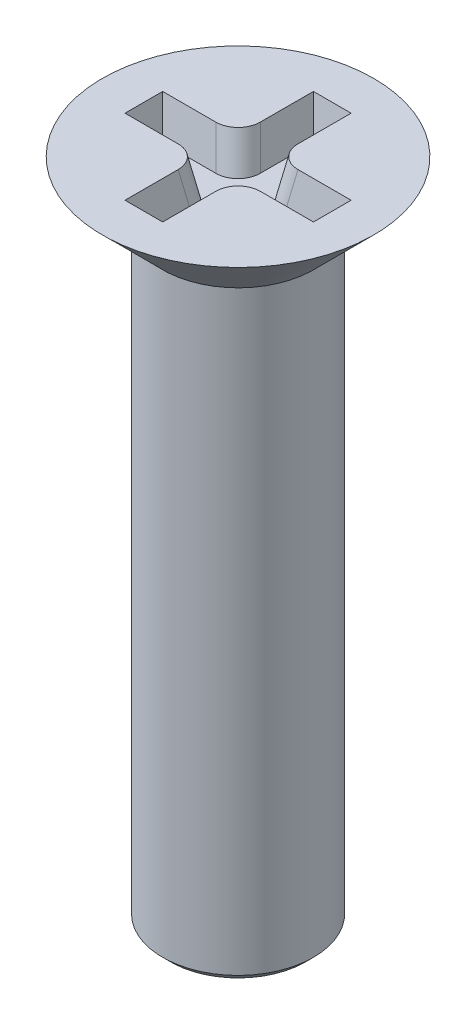
ISO-10303-21;
HEADER;
FILE_DESCRIPTION(('STEP AP214'),'2;1');
FILE_NAME('part.step','',(''),(''),'','','');
FILE_SCHEMA(('AUTOMOTIVE_DESIGN { 1 0 10303 214 1 1 1 1 }'));
ENDSEC;
DATA;
#1=APPLICATION_CONTEXT('core data for automotive mechanical design processes');
#2=APPLICATION_PROTOCOL_DEFINITION('international standard','automotive_design',2000,#1);
#3=PRODUCT_CONTEXT('',#1,'mechanical');
#4=PRODUCT('Part','Part','',(#3));
#5=PRODUCT_RELATED_PRODUCT_CATEGORY('part','',(#4));
#6=PRODUCT_DEFINITION_FORMATION('','',#4);
#7=PRODUCT_DEFINITION_CONTEXT('part definition',#1,'design');
#8=PRODUCT_DEFINITION('design','',#6,#7);
#9=PRODUCT_DEFINITION_SHAPE('','',#8);
#10=(LENGTH_UNIT() NAMED_UNIT(*) SI_UNIT(.MILLI.,.METRE.));
#11=(NAMED_UNIT(*) PLANE_ANGLE_UNIT() SI_UNIT($,.RADIAN.));
#12=(NAMED_UNIT(*) SI_UNIT($,.STERADIAN.) SOLID_ANGLE_UNIT());
#13=UNCERTAINTY_MEASURE_WITH_UNIT(LENGTH_MEASURE(1.E-05),#10,'distance_accuracy_value','');
#14=(GEOMETRIC_REPRESENTATION_CONTEXT(3) GLOBAL_UNCERTAINTY_ASSIGNED_CONTEXT((#13)) GLOBAL_UNIT_ASSIGNED_CONTEXT((#10,
#11,#12)) REPRESENTATION_CONTEXT('',''));
#15=CARTESIAN_POINT('',(0.,0.,0.));
#16=DIRECTION('',(0.,0.,1.));
#17=DIRECTION('',(1.,0.,0.));
#18=AXIS2_PLACEMENT_3D('',#15,#16,#17);
#19=CARTESIAN_POINT('',(0.,0.,0.));
#20=DIRECTION('',(0.,1.,0.));
#21=DIRECTION('',(0.,0.,1.));
#22=AXIS2_PLACEMENT_3D('',#19,#20,#21);
#23=PLANE('',#22);
#24=CARTESIAN_POINT('',(0.,0.,0.));
#25=DIRECTION('',(0.,-1.,0.));
#26=DIRECTION('',(0.,0.,-1.));
#27=AXIS2_PLACEMENT_3D('',#24,#25,#26);
#28=CIRCLE('',#27,1.8);
#29=CARTESIAN_POINT('',(0.,0.,-1.8));
#30=VERTEX_POINT('',#29);
#31=EDGE_CURVE('E256',#30,#30,#28,.T.);
#32=ORIENTED_EDGE('',*,*,#31,.F.);
#33=EDGE_LOOP('',(#32));
#34=FACE_BOUND('',#33,.T.);
#35=DIRECTION('',(1.,0.,0.));
#36=VECTOR('',#35,1.);
#37=CARTESIAN_POINT('',(0.,0.,-0.25));
#38=LINE('',#37,#36);
#39=CARTESIAN_POINT('',(-1.25,0.,-0.25));
#40=VERTEX_POINT('',#39);
#41=CARTESIAN_POINT('',(-0.545442325903662,0.,-0.25));
#42=VERTEX_POINT('',#41);
#43=EDGE_CURVE('E186',#40,#42,#38,.T.);
#44=ORIENTED_EDGE('',*,*,#43,.T.);
#45=CARTESIAN_POINT('',(-0.554627983565723,0.,-0.554627983565723));
#46=DIRECTION('',(0.,1.,0.));
#47=DIRECTION('',(-0.707106781186548,0.,-0.707106781186547));
#48=AXIS2_PLACEMENT_3D('',#45,#46,#47);
#49=ELLIPSE('',#48,0.309186702079241,0.3);
#50=CARTESIAN_POINT('',(-0.25,0.,-0.545442325903662));
#51=VERTEX_POINT('',#50);
#52=EDGE_CURVE('E274',#42,#51,#49,.T.);
#53=ORIENTED_EDGE('',*,*,#52,.T.);
#54=DIRECTION('',(0.,0.,1.));
#55=VECTOR('',#54,1.);
#56=CARTESIAN_POINT('',(-0.25,0.,0.));
#57=LINE('',#56,#55);
#58=CARTESIAN_POINT('',(-0.25,0.,-1.25));
#59=VERTEX_POINT('',#58);
#60=EDGE_CURVE('E184',#59,#51,#57,.T.);
#61=ORIENTED_EDGE('',*,*,#60,.F.);
#62=DIRECTION('',(1.,0.,0.));
#63=VECTOR('',#62,1.);
#64=CARTESIAN_POINT('',(0.,0.,-1.25));
#65=LINE('',#64,#63);
#66=CARTESIAN_POINT('',(0.25,0.,-1.25));
#67=VERTEX_POINT('',#66);
#68=EDGE_CURVE('E163',#59,#67,#65,.T.);
#69=ORIENTED_EDGE('',*,*,#68,.T.);
#70=DIRECTION('',(0.,0.,1.));
#71=VECTOR('',#70,1.);
#72=CARTESIAN_POINT('',(0.25,0.,0.));
#73=LINE('',#72,#71);
#74=CARTESIAN_POINT('',(0.25,0.,-0.545442325903662));
#75=VERTEX_POINT('',#74);
#76=EDGE_CURVE('E175',#67,#75,#73,.T.);
#77=ORIENTED_EDGE('',*,*,#76,.T.);
#78=CARTESIAN_POINT('',(0.554627983565724,0.,-0.554627983565723));
#79=DIRECTION('',(0.,1.,0.));
#80=DIRECTION('',(0.707106781186547,0.,-0.707106781186548));
#81=AXIS2_PLACEMENT_3D('',#78,#79,#80);
#82=ELLIPSE('',#81,0.309186702079241,0.3);
#83=CARTESIAN_POINT('',(0.545442325903663,0.,-0.25));
#84=VERTEX_POINT('',#83);
#85=EDGE_CURVE('E272',#75,#84,#82,.T.);
#86=ORIENTED_EDGE('',*,*,#85,.T.);
#87=DIRECTION('',(1.,0.,0.));
#88=VECTOR('',#87,1.);
#89=CARTESIAN_POINT('',(0.,0.,-0.25));
#90=LINE('',#89,#88);
#91=CARTESIAN_POINT('',(1.25,0.,-0.25));
#92=VERTEX_POINT('',#91);
#93=EDGE_CURVE('E180',#84,#92,#90,.T.);
#94=ORIENTED_EDGE('',*,*,#93,.T.);
#95=DIRECTION('',(0.,0.,-1.));
#96=VECTOR('',#95,1.);
#97=CARTESIAN_POINT('',(1.25,0.,0.));
#98=LINE('',#97,#96);
#99=CARTESIAN_POINT('',(1.25,0.,0.25));
#100=VERTEX_POINT('',#99);
#101=EDGE_CURVE('E206',#100,#92,#98,.T.);
#102=ORIENTED_EDGE('',*,*,#101,.F.);
#103=DIRECTION('',(1.,0.,0.));
#104=VECTOR('',#103,1.);
#105=CARTESIAN_POINT('',(0.,0.,0.25));
#106=LINE('',#105,#104);
#107=CARTESIAN_POINT('',(0.545442325903663,0.,0.25));
#108=VERTEX_POINT('',#107);
#109=EDGE_CURVE('E204',#108,#100,#106,.T.);
#110=ORIENTED_EDGE('',*,*,#109,.F.);
#111=CARTESIAN_POINT('',(0.554627983565724,0.,0.554627983565724));
#112=DIRECTION('',(0.,1.,0.));
#113=DIRECTION('',(0.707106781186548,0.,0.707106781186547));
#114=AXIS2_PLACEMENT_3D('',#111,#112,#113);
#115=ELLIPSE('',#114,0.309186702079241,0.3);
#116=CARTESIAN_POINT('',(0.25,0.,0.545442325903663));
#117=VERTEX_POINT('',#116);
#118=EDGE_CURVE('E268',#108,#117,#115,.T.);
#119=ORIENTED_EDGE('',*,*,#118,.T.);
#120=DIRECTION('',(0.,0.,1.));
#121=VECTOR('',#120,1.);
#122=CARTESIAN_POINT('',(0.25,0.,0.));
#123=LINE('',#122,#121);
#124=CARTESIAN_POINT('',(0.250000000000001,0.,1.25));
#125=VERTEX_POINT('',#124);
#126=EDGE_CURVE('E202',#117,#125,#123,.T.);
#127=ORIENTED_EDGE('',*,*,#126,.T.);
#128=DIRECTION('',(1.,0.,0.));
#129=VECTOR('',#128,1.);
#130=CARTESIAN_POINT('',(0.,0.,1.25));
#131=LINE('',#130,#129);
#132=CARTESIAN_POINT('',(-0.249999999999999,0.,1.25));
#133=VERTEX_POINT('',#132);
#134=EDGE_CURVE('E199',#133,#125,#131,.T.);
#135=ORIENTED_EDGE('',*,*,#134,.F.);
#136=DIRECTION('',(0.,0.,1.));
#137=VECTOR('',#136,1.);
#138=CARTESIAN_POINT('',(-0.25,0.,0.));
#139=LINE('',#138,#137);
#140=CARTESIAN_POINT('',(-0.25,0.,0.545442325903662));
#141=VERTEX_POINT('',#140);
#142=EDGE_CURVE('E197',#141,#133,#139,.T.);
#143=ORIENTED_EDGE('',*,*,#142,.F.);
#144=CARTESIAN_POINT('',(-0.554627983565723,0.,0.554627983565724));
#145=DIRECTION('',(0.,1.,0.));
#146=DIRECTION('',(-0.707106781186547,0.,0.707106781186548));
#147=AXIS2_PLACEMENT_3D('',#144,#145,#146);
#148=ELLIPSE('',#147,0.309186702079241,0.3);
#149=CARTESIAN_POINT('',(-0.545442325903662,0.,0.25));
#150=VERTEX_POINT('',#149);
#151=EDGE_CURVE('E270',#141,#150,#148,.T.);
#152=ORIENTED_EDGE('',*,*,#151,.T.);
#153=DIRECTION('',(1.,0.,0.));
#154=VECTOR('',#153,1.);
#155=CARTESIAN_POINT('',(0.,0.,0.25));
#156=LINE('',#155,#154);
#157=CARTESIAN_POINT('',(-1.25,0.,0.25));
#158=VERTEX_POINT('',#157);
#159=EDGE_CURVE('E194',#158,#150,#156,.T.);
#160=ORIENTED_EDGE('',*,*,#159,.F.);
#161=DIRECTION('',(0.,0.,-1.));
#162=VECTOR('',#161,1.);
#163=CARTESIAN_POINT('',(-1.25,0.,0.));
#164=LINE('',#163,#162);
#165=EDGE_CURVE('E191',#158,#40,#164,.T.);
#166=ORIENTED_EDGE('',*,*,#165,.T.);
#167=EDGE_LOOP('',(#44,#53,#61,#69,#77,#86,#94,#102,#110,#119,#127,#135,#143,#152,#160,#166));
#168=FACE_BOUND('',#167,.T.);
#169=ADVANCED_FACE('F47',(#34,#168),#23,.T.);
#170=CARTESIAN_POINT('',(0.,-0.8,0.));
#171=DIRECTION('',(0.,1.,0.));
#172=DIRECTION('',(0.,0.,1.));
#173=AXIS2_PLACEMENT_3D('',#170,#171,#172);
#174=CONICAL_SURFACE('',#173,1.,0.785398163397448);
#175=ORIENTED_EDGE('',*,*,#31,.T.);
#176=EDGE_LOOP('',(#175));
#177=FACE_BOUND('',#176,.T.);
#178=CARTESIAN_POINT('',(0.,-0.8,0.));
#179=DIRECTION('',(0.,-1.,0.));
#180=DIRECTION('',(0.,0.,-1.));
#181=AXIS2_PLACEMENT_3D('',#178,#179,#180);
#182=CIRCLE('',#181,1.);
#183=CARTESIAN_POINT('',(0.,-0.8,-1.));
#184=VERTEX_POINT('',#183);
#185=EDGE_CURVE('E212',#184,#184,#182,.T.);
#186=ORIENTED_EDGE('',*,*,#185,.F.);
#187=EDGE_LOOP('',(#186));
#188=FACE_BOUND('',#187,.T.);
#189=ADVANCED_FACE('F351',(#177,#188),#174,.T.);
#190=CARTESIAN_POINT('',(0.,-8.8,0.));
#191=DIRECTION('',(0.,1.,0.));
#192=DIRECTION('',(0.,0.,1.));
#193=AXIS2_PLACEMENT_3D('',#190,#191,#192);
#194=CYLINDRICAL_SURFACE('',#193,1.);
#195=CARTESIAN_POINT('',(0.,-8.7,0.));
#196=DIRECTION('',(0.,-1.,0.));
#197=DIRECTION('',(0.,0.,-1.));
#198=AXIS2_PLACEMENT_3D('',#195,#196,#197);
#199=CIRCLE('',#198,1.);
#200=CARTESIAN_POINT('',(0.,-8.7,-1.));
#201=VERTEX_POINT('',#200);
#202=EDGE_CURVE('E262',#201,#201,#199,.F.);
#203=ORIENTED_EDGE('',*,*,#202,.T.);
#204=EDGE_LOOP('',(#203));
#205=FACE_BOUND('',#204,.T.);
#206=ORIENTED_EDGE('',*,*,#185,.T.);
#207=EDGE_LOOP('',(#206));
#208=FACE_BOUND('',#207,.T.);
#209=ADVANCED_FACE('F359',(#205,#208),#194,.T.);
#210=CARTESIAN_POINT('',(0.,-8.8,0.));
#211=DIRECTION('',(0.,-1.,0.));
#212=DIRECTION('',(0.,0.,-1.));
#213=AXIS2_PLACEMENT_3D('',#210,#211,#212);
#214=PLANE('',#213);
#215=CARTESIAN_POINT('',(0.,-8.8,0.));
#216=DIRECTION('',(0.,-1.,0.));
#217=DIRECTION('',(0.,0.,-1.));
#218=AXIS2_PLACEMENT_3D('',#215,#216,#217);
#219=CIRCLE('',#218,0.900000000000001);
#220=CARTESIAN_POINT('',(0.,-8.8,-0.900000000000001));
#221=VERTEX_POINT('',#220);
#222=EDGE_CURVE('E259',#221,#221,#219,.T.);
#223=ORIENTED_EDGE('',*,*,#222,.T.);
#224=EDGE_LOOP('',(#223));
#225=FACE_BOUND('',#224,.T.);
#226=ADVANCED_FACE('F371',(#225),#214,.T.);
#227=CARTESIAN_POINT('',(0.,-8.8,0.));
#228=DIRECTION('',(0.,1.,0.));
#229=DIRECTION('',(0.,0.,1.));
#230=AXIS2_PLACEMENT_3D('',#227,#228,#229);
#231=CONICAL_SURFACE('',#230,0.900000000000001,0.78539816339744);
#232=ORIENTED_EDGE('',*,*,#202,.F.);
#233=EDGE_LOOP('',(#232));
#234=FACE_BOUND('',#233,.T.);
#235=ORIENTED_EDGE('',*,*,#222,.F.);
#236=EDGE_LOOP('',(#235));
#237=FACE_BOUND('',#236,.T.);
#238=ADVANCED_FACE('F366',(#234,#237),#231,.T.);
#239=CARTESIAN_POINT('',(0.,0.,-0.25));
#240=DIRECTION('',(0.,-0.17364817766693,-0.984807753012208));
#241=DIRECTION('',(0.,0.984807753012208,-0.17364817766693));
#242=AXIS2_PLACEMENT_3D('',#239,#240,#241);
#243=PLANE('',#242);
#244=ORIENTED_EDGE('',*,*,#93,.F.);
#245=DIRECTION('',(-0.171087869746036,-0.970287525247814,0.171087869746036));
#246=VECTOR('',#245,1.);
#247=CARTESIAN_POINT('',(0.529476651306003,-0.0905458400836372,-0.234034325402341));
#248=LINE('',#247,#246);
#249=CARTESIAN_POINT('',(0.45727883554943,-0.5,-0.161836509645767));
#250=VERTEX_POINT('',#249);
#251=EDGE_CURVE('E279',#84,#250,#248,.T.);
#252=ORIENTED_EDGE('',*,*,#251,.T.);
#253=DIRECTION('',(-1.,0.,0.));
#254=VECTOR('',#253,1.);
#255=CARTESIAN_POINT('',(0.,-0.5,-0.161836509645767));
#256=LINE('',#255,#254);
#257=CARTESIAN_POINT('',(1.16183650964577,-0.5,-0.161836509645767));
#258=VERTEX_POINT('',#257);
#259=EDGE_CURVE('E209',#250,#258,#256,.F.);
#260=ORIENTED_EDGE('',*,*,#259,.T.);
#261=DIRECTION('',(-0.171087869746036,-0.970287525247814,0.171087869746036));
#262=VECTOR('',#261,1.);
#263=CARTESIAN_POINT('',(1.2134111760322,-0.207505532169751,-0.213411176032204));
#264=LINE('',#263,#262);
#265=EDGE_CURVE('E210',#258,#92,#264,.F.);
#266=ORIENTED_EDGE('',*,*,#265,.T.);
#267=EDGE_LOOP('',(#244,#252,#260,#266));
#268=FACE_BOUND('',#267,.T.);
#269=ADVANCED_FACE('F335',(#268),#243,.F.);
#270=CARTESIAN_POINT('',(1.25,0.,0.));
#271=DIRECTION('',(0.984807753012208,-0.17364817766693,0.));
#272=DIRECTION('',(0.17364817766693,0.984807753012208,0.));
#273=AXIS2_PLACEMENT_3D('',#270,#271,#272);
#274=PLANE('',#273);
#275=ORIENTED_EDGE('',*,*,#101,.T.);
#276=ORIENTED_EDGE('',*,*,#265,.F.);
#277=DIRECTION('',(0.,0.,-1.));
#278=VECTOR('',#277,1.);
#279=CARTESIAN_POINT('',(1.16183650964577,-0.5,0.));
#280=LINE('',#279,#278);
#281=CARTESIAN_POINT('',(1.16183650964577,-0.5,0.161836509645768));
#282=VERTEX_POINT('',#281);
#283=EDGE_CURVE('E171',#282,#258,#280,.T.);
#284=ORIENTED_EDGE('',*,*,#283,.F.);
#285=DIRECTION('',(0.171087869746036,0.970287525247814,0.171087869746036));
#286=VECTOR('',#285,1.);
#287=CARTESIAN_POINT('',(1.2134111760322,-0.207505532169751,0.213411176032205));
#288=LINE('',#287,#286);
#289=EDGE_CURVE('E213',#282,#100,#288,.T.);
#290=ORIENTED_EDGE('',*,*,#289,.T.);
#291=EDGE_LOOP('',(#275,#276,#284,#290));
#292=FACE_BOUND('',#291,.T.);
#293=ADVANCED_FACE('F339',(#292),#274,.F.);
#294=CARTESIAN_POINT('',(0.,0.,0.25));
#295=DIRECTION('',(0.,-0.17364817766693,0.984807753012208));
#296=DIRECTION('',(0.,-0.984807753012208,-0.17364817766693));
#297=AXIS2_PLACEMENT_3D('',#294,#295,#296);
#298=PLANE('',#297);
#299=DIRECTION('',(1.,0.,0.));
#300=VECTOR('',#299,1.);
#301=CARTESIAN_POINT('',(0.,-0.5,0.161836509645768));
#302=LINE('',#301,#300);
#303=CARTESIAN_POINT('',(0.45727883554943,-0.5,0.161836509645768));
#304=VERTEX_POINT('',#303);
#305=EDGE_CURVE('E232',#304,#282,#302,.T.);
#306=ORIENTED_EDGE('',*,*,#305,.F.);
#307=DIRECTION('',(-0.171087869746036,-0.970287525247814,-0.171087869746036));
#308=VECTOR('',#307,1.);
#309=CARTESIAN_POINT('',(0.536794416099563,-0.049044733649687,0.2413520901959));
#310=LINE('',#309,#308);
#311=EDGE_CURVE('E286',#304,#108,#310,.F.);
#312=ORIENTED_EDGE('',*,*,#311,.T.);
#313=ORIENTED_EDGE('',*,*,#109,.T.);
#314=ORIENTED_EDGE('',*,*,#289,.F.);
#315=EDGE_LOOP('',(#306,#312,#313,#314));
#316=FACE_BOUND('',#315,.T.);
#317=ADVANCED_FACE('F343',(#316),#298,.F.);
#318=CARTESIAN_POINT('',(0.25,0.,0.));
#319=DIRECTION('',(0.984807753012208,-0.17364817766693,0.));
#320=DIRECTION('',(0.17364817766693,0.984807753012208,0.));
#321=AXIS2_PLACEMENT_3D('',#318,#319,#320);
#322=PLANE('',#321);
#323=ORIENTED_EDGE('',*,*,#126,.F.);
#324=DIRECTION('',(0.171087869746036,0.970287525247814,0.171087869746036));
#325=VECTOR('',#324,1.);
#326=CARTESIAN_POINT('',(0.153188599841668,-0.549044733649687,0.44863092574533));
#327=LINE('',#326,#325);
#328=CARTESIAN_POINT('',(0.161836509645768,-0.5,0.45727883554943));
#329=VERTEX_POINT('',#328);
#330=EDGE_CURVE('E62',#117,#329,#327,.F.);
#331=ORIENTED_EDGE('',*,*,#330,.T.);
#332=DIRECTION('',(0.,0.,-1.));
#333=VECTOR('',#332,1.);
#334=CARTESIAN_POINT('',(0.161836509645768,-0.5,0.));
#335=LINE('',#334,#333);
#336=CARTESIAN_POINT('',(0.161836509645768,-0.5,1.16183650964577));
#337=VERTEX_POINT('',#336);
#338=EDGE_CURVE('E234',#329,#337,#335,.F.);
#339=ORIENTED_EDGE('',*,*,#338,.T.);
#340=DIRECTION('',(-0.171087869746036,-0.970287525247814,-0.171087869746036));
#341=VECTOR('',#340,1.);
#342=CARTESIAN_POINT('',(0.213411176032205,-0.207505532169751,1.2134111760322));
#343=LINE('',#342,#341);
#344=EDGE_CURVE('E223',#337,#125,#343,.F.);
#345=ORIENTED_EDGE('',*,*,#344,.T.);
#346=EDGE_LOOP('',(#323,#331,#339,#345));
#347=FACE_BOUND('',#346,.T.);
#348=ADVANCED_FACE('F461',(#347),#322,.F.);
#349=CARTESIAN_POINT('',(0.,0.,1.25));
#350=DIRECTION('',(0.,-0.17364817766693,0.984807753012208));
#351=DIRECTION('',(0.,-0.984807753012208,-0.17364817766693));
#352=AXIS2_PLACEMENT_3D('',#349,#350,#351);
#353=PLANE('',#352);
#354=ORIENTED_EDGE('',*,*,#134,.T.);
#355=ORIENTED_EDGE('',*,*,#344,.F.);
#356=DIRECTION('',(1.,0.,0.));
#357=VECTOR('',#356,1.);
#358=CARTESIAN_POINT('',(0.,-0.5,1.16183650964577));
#359=LINE('',#358,#357);
#360=CARTESIAN_POINT('',(-0.161836509645767,-0.5,1.16183650964577));
#361=VERTEX_POINT('',#360);
#362=EDGE_CURVE('E236',#361,#337,#359,.T.);
#363=ORIENTED_EDGE('',*,*,#362,.F.);
#364=DIRECTION('',(-0.171087869746036,0.970287525247814,0.171087869746036));
#365=VECTOR('',#364,1.);
#366=CARTESIAN_POINT('',(-0.213411176032204,-0.207505532169751,1.2134111760322));
#367=LINE('',#366,#365);
#368=EDGE_CURVE('E220',#361,#133,#367,.T.);
#369=ORIENTED_EDGE('',*,*,#368,.T.);
#370=EDGE_LOOP('',(#354,#355,#363,#369));
#371=FACE_BOUND('',#370,.T.);
#372=ADVANCED_FACE('F453',(#371),#353,.F.);
#373=CARTESIAN_POINT('',(-0.25,0.,0.));
#374=DIRECTION('',(-0.984807753012208,-0.17364817766693,0.));
#375=DIRECTION('',(0.17364817766693,-0.984807753012208,0.));
#376=AXIS2_PLACEMENT_3D('',#373,#374,#375);
#377=PLANE('',#376);
#378=DIRECTION('',(0.,0.,1.));
#379=VECTOR('',#378,1.);
#380=CARTESIAN_POINT('',(-0.161836509645767,-0.5,0.));
#381=LINE('',#380,#379);
#382=CARTESIAN_POINT('',(-0.161836509645767,-0.5,0.45727883554943));
#383=VERTEX_POINT('',#382);
#384=EDGE_CURVE('E239',#383,#361,#381,.T.);
#385=ORIENTED_EDGE('',*,*,#384,.F.);
#386=DIRECTION('',(-0.171087869746036,0.970287525247814,0.171087869746036));
#387=VECTOR('',#386,1.);
#388=CARTESIAN_POINT('',(-0.23403432540234,-0.0905458400836372,0.529476651306003));
#389=LINE('',#388,#387);
#390=EDGE_CURVE('E281',#383,#141,#389,.T.);
#391=ORIENTED_EDGE('',*,*,#390,.T.);
#392=ORIENTED_EDGE('',*,*,#142,.T.);
#393=ORIENTED_EDGE('',*,*,#368,.F.);
#394=EDGE_LOOP('',(#385,#391,#392,#393));
#395=FACE_BOUND('',#394,.T.);
#396=ADVANCED_FACE('F304',(#395),#377,.F.);
#397=CARTESIAN_POINT('',(0.,0.,0.25));
#398=DIRECTION('',(0.,-0.17364817766693,0.984807753012208));
#399=DIRECTION('',(0.,-0.984807753012208,-0.17364817766693));
#400=AXIS2_PLACEMENT_3D('',#397,#398,#399);
#401=PLANE('',#400);
#402=ORIENTED_EDGE('',*,*,#159,.T.);
#403=DIRECTION('',(-0.171087869746036,0.970287525247814,0.171087869746036));
#404=VECTOR('',#403,1.);
#405=CARTESIAN_POINT('',(-0.529476651306003,-0.0905458400836371,0.234034325402341));
#406=LINE('',#405,#404);
#407=CARTESIAN_POINT('',(-0.457278835549429,-0.5,0.161836509645768));
#408=VERTEX_POINT('',#407);
#409=EDGE_CURVE('E284',#150,#408,#406,.F.);
#410=ORIENTED_EDGE('',*,*,#409,.T.);
#411=DIRECTION('',(1.,0.,0.));
#412=VECTOR('',#411,1.);
#413=CARTESIAN_POINT('',(0.,-0.5,0.161836509645768));
#414=LINE('',#413,#412);
#415=CARTESIAN_POINT('',(-1.16183650964577,-0.5,0.161836509645768));
#416=VERTEX_POINT('',#415);
#417=EDGE_CURVE('E241',#416,#408,#414,.T.);
#418=ORIENTED_EDGE('',*,*,#417,.F.);
#419=DIRECTION('',(0.171087869746036,-0.970287525247814,-0.171087869746036));
#420=VECTOR('',#419,1.);
#421=CARTESIAN_POINT('',(-1.2134111760322,-0.207505532169751,0.213411176032205));
#422=LINE('',#421,#420);
#423=EDGE_CURVE('E218',#416,#158,#422,.F.);
#424=ORIENTED_EDGE('',*,*,#423,.T.);
#425=EDGE_LOOP('',(#402,#410,#418,#424));
#426=FACE_BOUND('',#425,.T.);
#427=ADVANCED_FACE('F311',(#426),#401,.F.);
#428=CARTESIAN_POINT('',(-1.25,0.,0.));
#429=DIRECTION('',(-0.984807753012208,-0.17364817766693,0.));
#430=DIRECTION('',(0.17364817766693,-0.984807753012208,0.));
#431=AXIS2_PLACEMENT_3D('',#428,#429,#430);
#432=PLANE('',#431);
#433=ORIENTED_EDGE('',*,*,#165,.F.);
#434=ORIENTED_EDGE('',*,*,#423,.F.);
#435=DIRECTION('',(0.,0.,1.));
#436=VECTOR('',#435,1.);
#437=CARTESIAN_POINT('',(-1.16183650964577,-0.5,0.));
#438=LINE('',#437,#436);
#439=CARTESIAN_POINT('',(-1.16183650964577,-0.5,-0.161836509645767));
#440=VERTEX_POINT('',#439);
#441=EDGE_CURVE('E244',#416,#440,#438,.F.);
#442=ORIENTED_EDGE('',*,*,#441,.T.);
#443=DIRECTION('',(-0.171087869746036,0.970287525247814,-0.171087869746036));
#444=VECTOR('',#443,1.);
#445=CARTESIAN_POINT('',(-1.2134111760322,-0.207505532169751,-0.213411176032204));
#446=LINE('',#445,#444);
#447=EDGE_CURVE('E216',#440,#40,#446,.T.);
#448=ORIENTED_EDGE('',*,*,#447,.T.);
#449=EDGE_LOOP('',(#433,#434,#442,#448));
#450=FACE_BOUND('',#449,.T.);
#451=ADVANCED_FACE('F314',(#450),#432,.F.);
#452=CARTESIAN_POINT('',(0.,0.,-0.25));
#453=DIRECTION('',(0.,-0.17364817766693,-0.984807753012208));
#454=DIRECTION('',(0.,0.984807753012208,-0.17364817766693));
#455=AXIS2_PLACEMENT_3D('',#452,#453,#454);
#456=PLANE('',#455);
#457=DIRECTION('',(-1.,0.,0.));
#458=VECTOR('',#457,1.);
#459=CARTESIAN_POINT('',(0.,-0.5,-0.161836509645767));
#460=LINE('',#459,#458);
#461=CARTESIAN_POINT('',(-0.457278835549429,-0.5,-0.161836509645767));
#462=VERTEX_POINT('',#461);
#463=EDGE_CURVE('E246',#440,#462,#460,.F.);
#464=ORIENTED_EDGE('',*,*,#463,.T.);
#465=DIRECTION('',(-0.171087869746036,0.970287525247814,-0.171087869746036));
#466=VECTOR('',#465,1.);
#467=CARTESIAN_POINT('',(-0.536794416099562,-0.0490447336496869,-0.2413520901959));
#468=LINE('',#467,#466);
#469=EDGE_CURVE('E265',#462,#42,#468,.T.);
#470=ORIENTED_EDGE('',*,*,#469,.T.);
#471=ORIENTED_EDGE('',*,*,#43,.F.);
#472=ORIENTED_EDGE('',*,*,#447,.F.);
#473=EDGE_LOOP('',(#464,#470,#471,#472));
#474=FACE_BOUND('',#473,.T.);
#475=ADVANCED_FACE('F318',(#474),#456,.F.);
#476=CARTESIAN_POINT('',(-0.25,0.,0.));
#477=DIRECTION('',(-0.984807753012208,-0.17364817766693,0.));
#478=DIRECTION('',(0.17364817766693,-0.984807753012208,0.));
#479=AXIS2_PLACEMENT_3D('',#476,#477,#478);
#480=PLANE('',#479);
#481=ORIENTED_EDGE('',*,*,#60,.T.);
#482=DIRECTION('',(0.171087869746036,-0.970287525247814,0.171087869746036));
#483=VECTOR('',#482,1.);
#484=CARTESIAN_POINT('',(-0.153188599841667,-0.549044733649687,-0.44863092574533));
#485=LINE('',#484,#483);
#486=CARTESIAN_POINT('',(-0.161836509645767,-0.5,-0.45727883554943));
#487=VERTEX_POINT('',#486);
#488=EDGE_CURVE('E276',#51,#487,#485,.T.);
#489=ORIENTED_EDGE('',*,*,#488,.T.);
#490=DIRECTION('',(0.,0.,1.));
#491=VECTOR('',#490,1.);
#492=CARTESIAN_POINT('',(-0.161836509645767,-0.5,0.));
#493=LINE('',#492,#491);
#494=CARTESIAN_POINT('',(-0.161836509645767,-0.5,-1.16183650964577));
#495=VERTEX_POINT('',#494);
#496=EDGE_CURVE('E249',#495,#487,#493,.T.);
#497=ORIENTED_EDGE('',*,*,#496,.F.);
#498=DIRECTION('',(0.171087869746036,-0.970287525247814,0.171087869746036));
#499=VECTOR('',#498,1.);
#500=CARTESIAN_POINT('',(-0.213411176032204,-0.207505532169751,-1.2134111760322));
#501=LINE('',#500,#499);
#502=EDGE_CURVE('E170',#495,#59,#501,.F.);
#503=ORIENTED_EDGE('',*,*,#502,.T.);
#504=EDGE_LOOP('',(#481,#489,#497,#503));
#505=FACE_BOUND('',#504,.T.);
#506=ADVANCED_FACE('F327',(#505),#480,.F.);
#507=CARTESIAN_POINT('',(0.,0.,-1.25));
#508=DIRECTION('',(0.,-0.17364817766693,-0.984807753012208));
#509=DIRECTION('',(0.,0.984807753012208,-0.17364817766693));
#510=AXIS2_PLACEMENT_3D('',#507,#508,#509);
#511=PLANE('',#510);
#512=ORIENTED_EDGE('',*,*,#68,.F.);
#513=ORIENTED_EDGE('',*,*,#502,.F.);
#514=DIRECTION('',(-1.,0.,0.));
#515=VECTOR('',#514,1.);
#516=CARTESIAN_POINT('',(0.,-0.5,-1.16183650964577));
#517=LINE('',#516,#515);
#518=CARTESIAN_POINT('',(0.161836509645768,-0.5,-1.16183650964577));
#519=VERTEX_POINT('',#518);
#520=EDGE_CURVE('E166',#495,#519,#517,.F.);
#521=ORIENTED_EDGE('',*,*,#520,.T.);
#522=DIRECTION('',(0.171087869746036,0.970287525247814,-0.171087869746036));
#523=VECTOR('',#522,1.);
#524=CARTESIAN_POINT('',(0.213411176032205,-0.207505532169751,-1.2134111760322));
#525=LINE('',#524,#523);
#526=EDGE_CURVE('E159',#519,#67,#525,.T.);
#527=ORIENTED_EDGE('',*,*,#526,.T.);
#528=EDGE_LOOP('',(#512,#513,#521,#527));
#529=FACE_BOUND('',#528,.T.);
#530=ADVANCED_FACE('F161',(#529),#511,.F.);
#531=CARTESIAN_POINT('',(0.25,0.,0.));
#532=DIRECTION('',(0.984807753012208,-0.17364817766693,0.));
#533=DIRECTION('',(0.17364817766693,0.984807753012208,0.));
#534=AXIS2_PLACEMENT_3D('',#531,#532,#533);
#535=PLANE('',#534);
#536=DIRECTION('',(0.,0.,-1.));
#537=VECTOR('',#536,1.);
#538=CARTESIAN_POINT('',(0.161836509645768,-0.5,0.));
#539=LINE('',#538,#537);
#540=CARTESIAN_POINT('',(0.161836509645768,-0.5,-0.45727883554943));
#541=VERTEX_POINT('',#540);
#542=EDGE_CURVE('E229',#519,#541,#539,.F.);
#543=ORIENTED_EDGE('',*,*,#542,.T.);
#544=DIRECTION('',(-0.171087869746036,-0.970287525247814,0.171087869746036));
#545=VECTOR('',#544,1.);
#546=CARTESIAN_POINT('',(0.234034325402341,-0.0905458400836371,-0.529476651306003));
#547=LINE('',#546,#545);
#548=EDGE_CURVE('E178',#541,#75,#547,.F.);
#549=ORIENTED_EDGE('',*,*,#548,.T.);
#550=ORIENTED_EDGE('',*,*,#76,.F.);
#551=ORIENTED_EDGE('',*,*,#526,.F.);
#552=EDGE_LOOP('',(#543,#549,#550,#551));
#553=FACE_BOUND('',#552,.T.);
#554=ADVANCED_FACE('F176',(#553),#535,.F.);
#555=CARTESIAN_POINT('',(0.,-0.5,0.));
#556=DIRECTION('',(0.,1.,0.));
#557=DIRECTION('',(0.,0.,1.));
#558=AXIS2_PLACEMENT_3D('',#555,#556,#557);
#559=PLANE('',#558);
#560=ORIENTED_EDGE('',*,*,#259,.F.);
#561=CARTESIAN_POINT('',(0.466464493211491,-0.5,-0.466464493211491));
#562=DIRECTION('',(0.,1.,0.));
#563=DIRECTION('',(0.707106781186547,0.,-0.707106781186548));
#564=AXIS2_PLACEMENT_3D('',#561,#562,#563);
#565=ELLIPSE('',#564,0.309186702079241,0.3);
#566=EDGE_CURVE('E292',#250,#541,#565,.F.);
#567=ORIENTED_EDGE('',*,*,#566,.T.);
#568=ORIENTED_EDGE('',*,*,#542,.F.);
#569=ORIENTED_EDGE('',*,*,#520,.F.);
#570=ORIENTED_EDGE('',*,*,#496,.T.);
#571=CARTESIAN_POINT('',(-0.466464493211491,-0.5,-0.466464493211491));
#572=DIRECTION('',(0.,1.,0.));
#573=DIRECTION('',(-0.707106781186548,0.,-0.707106781186547));
#574=AXIS2_PLACEMENT_3D('',#571,#572,#573);
#575=ELLIPSE('',#574,0.309186702079241,0.3);
#576=EDGE_CURVE('E290',#487,#462,#575,.F.);
#577=ORIENTED_EDGE('',*,*,#576,.T.);
#578=ORIENTED_EDGE('',*,*,#463,.F.);
#579=ORIENTED_EDGE('',*,*,#441,.F.);
#580=ORIENTED_EDGE('',*,*,#417,.T.);
#581=CARTESIAN_POINT('',(-0.46646449321149,-0.5,0.466464493211491));
#582=DIRECTION('',(0.,1.,0.));
#583=DIRECTION('',(-0.707106781186547,0.,0.707106781186548));
#584=AXIS2_PLACEMENT_3D('',#581,#582,#583);
#585=ELLIPSE('',#584,0.309186702079241,0.3);
#586=EDGE_CURVE('E55',#408,#383,#585,.F.);
#587=ORIENTED_EDGE('',*,*,#586,.T.);
#588=ORIENTED_EDGE('',*,*,#384,.T.);
#589=ORIENTED_EDGE('',*,*,#362,.T.);
#590=ORIENTED_EDGE('',*,*,#338,.F.);
#591=CARTESIAN_POINT('',(0.466464493211491,-0.5,0.466464493211491));
#592=DIRECTION('',(0.,1.,0.));
#593=DIRECTION('',(0.707106781186548,0.,0.707106781186547));
#594=AXIS2_PLACEMENT_3D('',#591,#592,#593);
#595=ELLIPSE('',#594,0.309186702079241,0.3);
#596=EDGE_CURVE('E11',#329,#304,#595,.F.);
#597=ORIENTED_EDGE('',*,*,#596,.T.);
#598=ORIENTED_EDGE('',*,*,#305,.T.);
#599=ORIENTED_EDGE('',*,*,#283,.T.);
#600=EDGE_LOOP('',(#560,#567,#568,#569,#570,#577,#578,#579,#580,#587,#588,#589,#590,#597,#598,#599));
#601=FACE_BOUND('',#600,.T.);
#602=ADVANCED_FACE('F296',(#601),#559,.T.);
#603=CARTESIAN_POINT('',(-0.529476651306003,-0.142640293383716,-0.529476651306003));
#604=DIRECTION('',(-0.171087869746036,0.970287525247814,-0.171087869746036));
#605=DIRECTION('',(-0.984807753012208,-0.17364817766693,0.));
#606=AXIS2_PLACEMENT_3D('',#603,#604,#605);
#607=CYLINDRICAL_SURFACE('',#606,0.3);
#608=ORIENTED_EDGE('',*,*,#576,.F.);
#609=ORIENTED_EDGE('',*,*,#488,.F.);
#610=ORIENTED_EDGE('',*,*,#52,.F.);
#611=ORIENTED_EDGE('',*,*,#469,.F.);
#612=EDGE_LOOP('',(#608,#609,#610,#611));
#613=FACE_BOUND('',#612,.T.);
#614=ADVANCED_FACE('F323',(#613),#607,.T.);
#615=CARTESIAN_POINT('',(0.529476651306003,-0.142640293383716,-0.529476651306003));
#616=DIRECTION('',(0.171087869746036,0.970287525247814,-0.171087869746036));
#617=DIRECTION('',(0.,0.17364817766693,0.984807753012208));
#618=AXIS2_PLACEMENT_3D('',#615,#616,#617);
#619=CYLINDRICAL_SURFACE('',#618,0.3);
#620=ORIENTED_EDGE('',*,*,#566,.F.);
#621=ORIENTED_EDGE('',*,*,#251,.F.);
#622=ORIENTED_EDGE('',*,*,#85,.F.);
#623=ORIENTED_EDGE('',*,*,#548,.F.);
#624=EDGE_LOOP('',(#620,#621,#622,#623));
#625=FACE_BOUND('',#624,.T.);
#626=ADVANCED_FACE('F330',(#625),#619,.T.);
#627=CARTESIAN_POINT('',(-0.529476651306003,-0.142640293383716,0.529476651306003));
#628=DIRECTION('',(-0.171087869746036,0.970287525247814,0.171087869746036));
#629=DIRECTION('',(0.,-0.17364817766693,0.984807753012208));
#630=AXIS2_PLACEMENT_3D('',#627,#628,#629);
#631=CYLINDRICAL_SURFACE('',#630,0.3);
#632=ORIENTED_EDGE('',*,*,#586,.F.);
#633=ORIENTED_EDGE('',*,*,#409,.F.);
#634=ORIENTED_EDGE('',*,*,#151,.F.);
#635=ORIENTED_EDGE('',*,*,#390,.F.);
#636=EDGE_LOOP('',(#632,#633,#634,#635));
#637=FACE_BOUND('',#636,.T.);
#638=ADVANCED_FACE('F307',(#637),#631,.T.);
#639=CARTESIAN_POINT('',(0.529476651306004,-0.142640293383716,0.529476651306003));
#640=DIRECTION('',(0.171087869746036,0.970287525247814,0.171087869746036));
#641=DIRECTION('',(-0.984807753012208,0.17364817766693,0.));
#642=AXIS2_PLACEMENT_3D('',#639,#640,#641);
#643=CYLINDRICAL_SURFACE('',#642,0.3);
#644=ORIENTED_EDGE('',*,*,#596,.F.);
#645=ORIENTED_EDGE('',*,*,#330,.F.);
#646=ORIENTED_EDGE('',*,*,#118,.F.);
#647=ORIENTED_EDGE('',*,*,#311,.F.);
#648=EDGE_LOOP('',(#644,#645,#646,#647));
#649=FACE_BOUND('',#648,.T.);
#650=ADVANCED_FACE('F49',(#649),#643,.T.);
#651=CLOSED_SHELL('',(#169,#189,#209,#226,#238,#269,#293,#317,#348,#372,#396,#427,#451,#475,
#506,#530,#554,#602,#614,#626,#638,#650));
#652=MANIFOLD_SOLID_BREP('B2',#651);
#653=ADVANCED_BREP_SHAPE_REPRESENTATION('',(#18,#652),#14);
#654=SHAPE_DEFINITION_REPRESENTATION(#9,#653);
ENDSEC;
END-ISO-10303-21;
